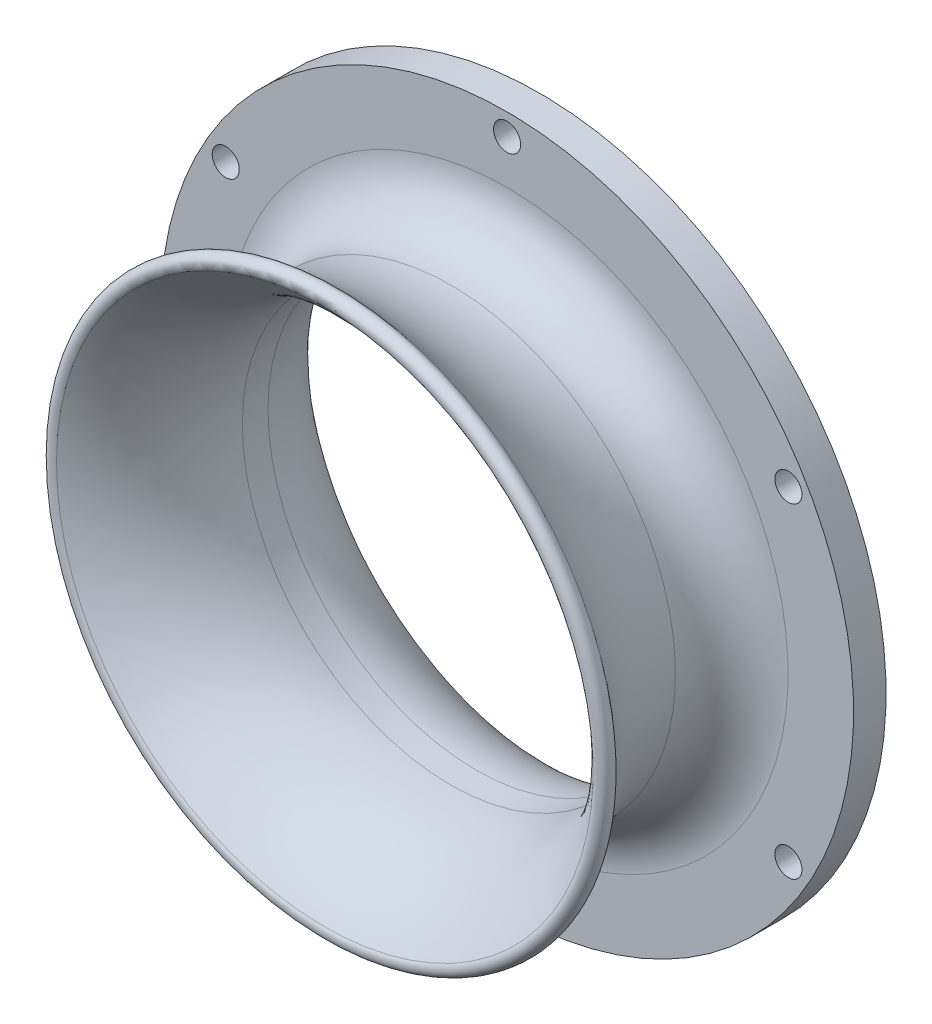
ISO-10303-21;
HEADER;
FILE_DESCRIPTION(('STEP AP214'),'2;1');
FILE_NAME('part.step','',(''),(''),'','','');
FILE_SCHEMA(('AUTOMOTIVE_DESIGN { 1 0 10303 214 1 1 1 1 }'));
ENDSEC;
DATA;
#1=APPLICATION_CONTEXT('core data for automotive mechanical design processes');
#2=APPLICATION_PROTOCOL_DEFINITION('international standard','automotive_design',2000,#1);
#3=PRODUCT_CONTEXT('',#1,'mechanical');
#4=PRODUCT('Part','Part','',(#3));
#5=PRODUCT_RELATED_PRODUCT_CATEGORY('part','',(#4));
#6=PRODUCT_DEFINITION_FORMATION('','',#4);
#7=PRODUCT_DEFINITION_CONTEXT('part definition',#1,'design');
#8=PRODUCT_DEFINITION('design','',#6,#7);
#9=PRODUCT_DEFINITION_SHAPE('','',#8);
#10=(LENGTH_UNIT() NAMED_UNIT(*) SI_UNIT(.MILLI.,.METRE.));
#11=(NAMED_UNIT(*) PLANE_ANGLE_UNIT() SI_UNIT($,.RADIAN.));
#12=(NAMED_UNIT(*) SI_UNIT($,.STERADIAN.) SOLID_ANGLE_UNIT());
#13=UNCERTAINTY_MEASURE_WITH_UNIT(LENGTH_MEASURE(1.E-05),#10,'distance_accuracy_value','');
#14=(GEOMETRIC_REPRESENTATION_CONTEXT(3) GLOBAL_UNCERTAINTY_ASSIGNED_CONTEXT((#13)) GLOBAL_UNIT_ASSIGNED_CONTEXT((#10,
#11,#12)) REPRESENTATION_CONTEXT('',''));
#15=CARTESIAN_POINT('',(0.,0.,0.));
#16=DIRECTION('',(0.,0.,1.));
#17=DIRECTION('',(1.,0.,0.));
#18=AXIS2_PLACEMENT_3D('',#15,#16,#17);
#19=CARTESIAN_POINT('',(0.,0.,-2.37036240834314));
#20=DIRECTION('',(0.,0.,-1.));
#21=DIRECTION('',(-1.,0.,0.));
#22=AXIS2_PLACEMENT_3D('',#19,#20,#21);
#23=TOROIDAL_SURFACE('',#22,28.1,8.85);
#24=CARTESIAN_POINT('',(0.,0.,-11.2));
#25=DIRECTION('',(0.,0.,-1.));
#26=DIRECTION('',(-1.,0.,0.));
#27=AXIS2_PLACEMENT_3D('',#24,#25,#26);
#28=CIRCLE('',#27,27.5);
#29=CARTESIAN_POINT('',(-27.5,0.,-11.2));
#30=VERTEX_POINT('',#29);
#31=EDGE_CURVE('E10',#30,#30,#28,.T.);
#32=ORIENTED_EDGE('',*,*,#31,.T.);
#33=EDGE_LOOP('',(#32));
#34=FACE_BOUND('',#33,.T.);
#35=CARTESIAN_POINT('',(0.,0.,-2.37036240834314));
#36=DIRECTION('',(0.,0.,-1.));
#37=DIRECTION('',(-1.,0.,0.));
#38=AXIS2_PLACEMENT_3D('',#35,#36,#37);
#39=CIRCLE('',#38,19.25);
#40=CARTESIAN_POINT('',(-19.25,0.,-2.37036240834314));
#41=VERTEX_POINT('',#40);
#42=EDGE_CURVE('E64',#41,#41,#39,.T.);
#43=ORIENTED_EDGE('',*,*,#42,.F.);
#44=EDGE_LOOP('',(#43));
#45=FACE_BOUND('',#44,.T.);
#46=ADVANCED_FACE('F30',(#34,#45),#23,.T.);
#47=CARTESIAN_POINT('',(0.,0.,0.));
#48=DIRECTION('',(0.,0.,-1.));
#49=DIRECTION('',(-1.,0.,0.));
#50=AXIS2_PLACEMENT_3D('',#47,#48,#49);
#51=CYLINDRICAL_SURFACE('',#50,27.5);
#52=CARTESIAN_POINT('',(0.,0.,-8.2));
#53=DIRECTION('',(0.,0.,-1.));
#54=DIRECTION('',(-1.,0.,0.));
#55=AXIS2_PLACEMENT_3D('',#52,#53,#54);
#56=CIRCLE('',#55,27.5);
#57=CARTESIAN_POINT('',(-27.5,0.,-8.2));
#58=VERTEX_POINT('',#57);
#59=EDGE_CURVE('E36',#58,#58,#56,.T.);
#60=ORIENTED_EDGE('',*,*,#59,.T.);
#61=EDGE_LOOP('',(#60));
#62=FACE_BOUND('',#61,.T.);
#63=ORIENTED_EDGE('',*,*,#31,.F.);
#64=EDGE_LOOP('',(#63));
#65=FACE_BOUND('',#64,.T.);
#66=ADVANCED_FACE('F134',(#62,#65),#51,.T.);
#67=CARTESIAN_POINT('',(0.,27.5,-8.2));
#68=DIRECTION('',(0.,0.,-1.));
#69=DIRECTION('',(-1.,0.,0.));
#70=AXIS2_PLACEMENT_3D('',#67,#68,#69);
#71=PLANE('',#70);
#72=CARTESIAN_POINT('',(-25.980762113533,15.0000000000003,-8.2));
#73=DIRECTION('',(0.,0.,-1.));
#74=DIRECTION('',(-1.,0.,0.));
#75=AXIS2_PLACEMENT_3D('',#72,#73,#74);
#76=CIRCLE('',#75,1.25);
#77=CARTESIAN_POINT('',(-27.230762113533,15.0000000000003,-8.2));
#78=VERTEX_POINT('',#77);
#79=EDGE_CURVE('E97',#78,#78,#76,.T.);
#80=ORIENTED_EDGE('',*,*,#79,.F.);
#81=EDGE_LOOP('',(#80));
#82=FACE_BOUND('',#81,.T.);
#83=CARTESIAN_POINT('',(-25.9807621135333,-14.9999999999998,-8.2));
#84=DIRECTION('',(0.,0.,-1.));
#85=DIRECTION('',(-1.,0.,0.));
#86=AXIS2_PLACEMENT_3D('',#83,#84,#85);
#87=CIRCLE('',#86,1.25);
#88=CARTESIAN_POINT('',(-27.2307621135333,-14.9999999999998,-8.2));
#89=VERTEX_POINT('',#88);
#90=EDGE_CURVE('E91',#89,#89,#87,.T.);
#91=ORIENTED_EDGE('',*,*,#90,.F.);
#92=EDGE_LOOP('',(#91));
#93=FACE_BOUND('',#92,.T.);
#94=CARTESIAN_POINT('',(0.,-30.,-8.2));
#95=DIRECTION('',(0.,0.,-1.));
#96=DIRECTION('',(-1.,0.,0.));
#97=AXIS2_PLACEMENT_3D('',#94,#95,#96);
#98=CIRCLE('',#97,1.25);
#99=CARTESIAN_POINT('',(-1.25,-30.,-8.2));
#100=VERTEX_POINT('',#99);
#101=EDGE_CURVE('E85',#100,#100,#98,.T.);
#102=ORIENTED_EDGE('',*,*,#101,.F.);
#103=EDGE_LOOP('',(#102));
#104=FACE_BOUND('',#103,.T.);
#105=CARTESIAN_POINT('',(25.9807621135331,-15.0000000000001,-8.2));
#106=DIRECTION('',(0.,0.,-1.));
#107=DIRECTION('',(-1.,0.,0.));
#108=AXIS2_PLACEMENT_3D('',#105,#106,#107);
#109=CIRCLE('',#108,1.25);
#110=CARTESIAN_POINT('',(24.7307621135331,-15.0000000000001,-8.2));
#111=VERTEX_POINT('',#110);
#112=EDGE_CURVE('E79',#111,#111,#109,.T.);
#113=ORIENTED_EDGE('',*,*,#112,.F.);
#114=EDGE_LOOP('',(#113));
#115=FACE_BOUND('',#114,.T.);
#116=CARTESIAN_POINT('',(25.9807621135332,14.9999999999999,-8.2));
#117=DIRECTION('',(0.,0.,-1.));
#118=DIRECTION('',(-1.,0.,0.));
#119=AXIS2_PLACEMENT_3D('',#116,#117,#118);
#120=CIRCLE('',#119,1.25);
#121=CARTESIAN_POINT('',(24.7307621135332,14.9999999999999,-8.2));
#122=VERTEX_POINT('',#121);
#123=EDGE_CURVE('E73',#122,#122,#120,.T.);
#124=ORIENTED_EDGE('',*,*,#123,.F.);
#125=EDGE_LOOP('',(#124));
#126=FACE_BOUND('',#125,.T.);
#127=CARTESIAN_POINT('',(0.,30.,-8.2));
#128=DIRECTION('',(0.,0.,-1.));
#129=DIRECTION('',(-1.,0.,0.));
#130=AXIS2_PLACEMENT_3D('',#127,#128,#129);
#131=CIRCLE('',#130,1.25);
#132=CARTESIAN_POINT('',(-1.25,30.,-8.2));
#133=VERTEX_POINT('',#132);
#134=EDGE_CURVE('E67',#133,#133,#131,.T.);
#135=ORIENTED_EDGE('',*,*,#134,.F.);
#136=EDGE_LOOP('',(#135));
#137=FACE_BOUND('',#136,.T.);
#138=CARTESIAN_POINT('',(0.,0.,-8.2));
#139=DIRECTION('',(0.,0.,-1.));
#140=DIRECTION('',(-1.,0.,0.));
#141=AXIS2_PLACEMENT_3D('',#138,#139,#140);
#142=CIRCLE('',#141,32.);
#143=CARTESIAN_POINT('',(-32.,0.,-8.2));
#144=VERTEX_POINT('',#143);
#145=EDGE_CURVE('E40',#144,#144,#142,.T.);
#146=ORIENTED_EDGE('',*,*,#145,.T.);
#147=EDGE_LOOP('',(#146));
#148=FACE_BOUND('',#147,.T.);
#149=ORIENTED_EDGE('',*,*,#59,.F.);
#150=EDGE_LOOP('',(#149));
#151=FACE_BOUND('',#150,.T.);
#152=ADVANCED_FACE('F128',(#82,#93,#104,#115,#126,#137,#148,#151),#71,.T.);
#153=CARTESIAN_POINT('',(0.,0.,0.));
#154=DIRECTION('',(0.,0.,-1.));
#155=DIRECTION('',(-1.,0.,0.));
#156=AXIS2_PLACEMENT_3D('',#153,#154,#155);
#157=CYLINDRICAL_SURFACE('',#156,32.);
#158=CARTESIAN_POINT('',(0.,0.,-5.2));
#159=DIRECTION('',(0.,0.,-1.));
#160=DIRECTION('',(-1.,0.,0.));
#161=AXIS2_PLACEMENT_3D('',#158,#159,#160);
#162=CIRCLE('',#161,32.);
#163=CARTESIAN_POINT('',(-32.,0.,-5.2));
#164=VERTEX_POINT('',#163);
#165=EDGE_CURVE('E44',#164,#164,#162,.T.);
#166=ORIENTED_EDGE('',*,*,#165,.T.);
#167=EDGE_LOOP('',(#166));
#168=FACE_BOUND('',#167,.T.);
#169=ORIENTED_EDGE('',*,*,#145,.F.);
#170=EDGE_LOOP('',(#169));
#171=FACE_BOUND('',#170,.T.);
#172=ADVANCED_FACE('F110',(#168,#171),#157,.T.);
#173=CARTESIAN_POINT('',(0.,32.,-5.2));
#174=DIRECTION('',(0.,0.,1.));
#175=DIRECTION('',(1.,0.,0.));
#176=AXIS2_PLACEMENT_3D('',#173,#174,#175);
#177=PLANE('',#176);
#178=CARTESIAN_POINT('',(-25.980762113533,15.0000000000003,-5.2));
#179=DIRECTION('',(0.,0.,1.));
#180=DIRECTION('',(1.,0.,0.));
#181=AXIS2_PLACEMENT_3D('',#178,#179,#180);
#182=CIRCLE('',#181,1.25);
#183=CARTESIAN_POINT('',(-24.730762113533,15.0000000000003,-5.2));
#184=VERTEX_POINT('',#183);
#185=EDGE_CURVE('E100',#184,#184,#182,.T.);
#186=ORIENTED_EDGE('',*,*,#185,.F.);
#187=EDGE_LOOP('',(#186));
#188=FACE_BOUND('',#187,.T.);
#189=CARTESIAN_POINT('',(-25.9807621135333,-14.9999999999998,-5.2));
#190=DIRECTION('',(0.,0.,1.));
#191=DIRECTION('',(1.,0.,0.));
#192=AXIS2_PLACEMENT_3D('',#189,#190,#191);
#193=CIRCLE('',#192,1.25);
#194=CARTESIAN_POINT('',(-24.7307621135333,-14.9999999999998,-5.2));
#195=VERTEX_POINT('',#194);
#196=EDGE_CURVE('E94',#195,#195,#193,.T.);
#197=ORIENTED_EDGE('',*,*,#196,.F.);
#198=EDGE_LOOP('',(#197));
#199=FACE_BOUND('',#198,.T.);
#200=CARTESIAN_POINT('',(0.,-30.,-5.2));
#201=DIRECTION('',(0.,0.,1.));
#202=DIRECTION('',(1.,0.,0.));
#203=AXIS2_PLACEMENT_3D('',#200,#201,#202);
#204=CIRCLE('',#203,1.25);
#205=CARTESIAN_POINT('',(1.25,-30.,-5.2));
#206=VERTEX_POINT('',#205);
#207=EDGE_CURVE('E88',#206,#206,#204,.T.);
#208=ORIENTED_EDGE('',*,*,#207,.F.);
#209=EDGE_LOOP('',(#208));
#210=FACE_BOUND('',#209,.T.);
#211=CARTESIAN_POINT('',(25.9807621135331,-15.0000000000001,-5.2));
#212=DIRECTION('',(0.,0.,1.));
#213=DIRECTION('',(1.,0.,0.));
#214=AXIS2_PLACEMENT_3D('',#211,#212,#213);
#215=CIRCLE('',#214,1.25);
#216=CARTESIAN_POINT('',(27.2307621135331,-15.0000000000001,-5.2));
#217=VERTEX_POINT('',#216);
#218=EDGE_CURVE('E82',#217,#217,#215,.T.);
#219=ORIENTED_EDGE('',*,*,#218,.F.);
#220=EDGE_LOOP('',(#219));
#221=FACE_BOUND('',#220,.T.);
#222=CARTESIAN_POINT('',(25.9807621135332,14.9999999999999,-5.2));
#223=DIRECTION('',(0.,0.,1.));
#224=DIRECTION('',(1.,0.,0.));
#225=AXIS2_PLACEMENT_3D('',#222,#223,#224);
#226=CIRCLE('',#225,1.25);
#227=CARTESIAN_POINT('',(27.2307621135332,14.9999999999999,-5.2));
#228=VERTEX_POINT('',#227);
#229=EDGE_CURVE('E76',#228,#228,#226,.T.);
#230=ORIENTED_EDGE('',*,*,#229,.F.);
#231=EDGE_LOOP('',(#230));
#232=FACE_BOUND('',#231,.T.);
#233=CARTESIAN_POINT('',(0.,30.,-5.2));
#234=DIRECTION('',(0.,0.,1.));
#235=DIRECTION('',(1.,0.,0.));
#236=AXIS2_PLACEMENT_3D('',#233,#234,#235);
#237=CIRCLE('',#236,1.25);
#238=CARTESIAN_POINT('',(1.25,30.,-5.2));
#239=VERTEX_POINT('',#238);
#240=EDGE_CURVE('E70',#239,#239,#237,.T.);
#241=ORIENTED_EDGE('',*,*,#240,.F.);
#242=EDGE_LOOP('',(#241));
#243=FACE_BOUND('',#242,.T.);
#244=CARTESIAN_POINT('',(0.,0.,-5.2));
#245=DIRECTION('',(0.,0.,-1.));
#246=DIRECTION('',(-1.,0.,0.));
#247=AXIS2_PLACEMENT_3D('',#244,#245,#246);
#248=CIRCLE('',#247,25.95);
#249=CARTESIAN_POINT('',(-25.95,0.,-5.2));
#250=VERTEX_POINT('',#249);
#251=EDGE_CURVE('E49',#250,#250,#248,.T.);
#252=ORIENTED_EDGE('',*,*,#251,.T.);
#253=EDGE_LOOP('',(#252));
#254=FACE_BOUND('',#253,.T.);
#255=ORIENTED_EDGE('',*,*,#165,.F.);
#256=EDGE_LOOP('',(#255));
#257=FACE_BOUND('',#256,.T.);
#258=ADVANCED_FACE('F106',(#188,#199,#210,#221,#232,#243,#254,#257),#177,.T.);
#259=CARTESIAN_POINT('',(0.,0.,0.));
#260=DIRECTION('',(0.,0.,-1.));
#261=DIRECTION('',(-1.,0.,0.));
#262=AXIS2_PLACEMENT_3D('',#259,#260,#261);
#263=TOROIDAL_SURFACE('',#262,25.95,5.2);
#264=CARTESIAN_POINT('',(0.,0.,0.));
#265=DIRECTION('',(0.,0.,-1.));
#266=DIRECTION('',(-1.,0.,0.));
#267=AXIS2_PLACEMENT_3D('',#264,#265,#266);
#268=CIRCLE('',#267,20.75);
#269=CARTESIAN_POINT('',(-20.75,0.,0.));
#270=VERTEX_POINT('',#269);
#271=EDGE_CURVE('E52',#270,#270,#268,.T.);
#272=ORIENTED_EDGE('',*,*,#271,.T.);
#273=EDGE_LOOP('',(#272));
#274=FACE_BOUND('',#273,.T.);
#275=ORIENTED_EDGE('',*,*,#251,.F.);
#276=EDGE_LOOP('',(#275));
#277=FACE_BOUND('',#276,.T.);
#278=ADVANCED_FACE('F109',(#274,#277),#263,.F.);
#279=CARTESIAN_POINT('',(0.,0.,0.));
#280=DIRECTION('',(0.,0.,-1.));
#281=DIRECTION('',(-1.,0.,0.));
#282=AXIS2_PLACEMENT_3D('',#279,#280,#281);
#283=TOROIDAL_SURFACE('',#282,34.25,13.5);
#284=CARTESIAN_POINT('',(0.,0.,10.4684210526316));
#285=DIRECTION('',(0.,0.,-1.));
#286=DIRECTION('',(-1.,0.,0.));
#287=AXIS2_PLACEMENT_3D('',#284,#285,#286);
#288=CIRCLE('',#287,25.7257897336574);
#289=CARTESIAN_POINT('',(-25.7257897336574,0.,10.4684210526316));
#290=VERTEX_POINT('',#289);
#291=EDGE_CURVE('E55',#290,#290,#288,.T.);
#292=ORIENTED_EDGE('',*,*,#291,.T.);
#293=EDGE_LOOP('',(#292));
#294=FACE_BOUND('',#293,.T.);
#295=ORIENTED_EDGE('',*,*,#271,.F.);
#296=EDGE_LOOP('',(#295));
#297=FACE_BOUND('',#296,.T.);
#298=ADVANCED_FACE('F164',(#294,#297),#283,.F.);
#299=CARTESIAN_POINT('',(0.,0.,11.05));
#300=DIRECTION('',(0.,0.,-1.));
#301=DIRECTION('',(-1.,0.,0.));
#302=AXIS2_PLACEMENT_3D('',#299,#300,#301);
#303=TOROIDAL_SURFACE('',#302,25.2522224966384,0.75);
#304=CARTESIAN_POINT('',(0.,0.,11.6315789473684));
#305=DIRECTION('',(0.,0.,-1.));
#306=DIRECTION('',(-1.,0.,0.));
#307=AXIS2_PLACEMENT_3D('',#304,#305,#306);
#308=CIRCLE('',#307,24.7786552596194);
#309=CARTESIAN_POINT('',(-24.7786552596194,0.,11.6315789473684));
#310=VERTEX_POINT('',#309);
#311=EDGE_CURVE('E58',#310,#310,#308,.T.);
#312=ORIENTED_EDGE('',*,*,#311,.T.);
#313=EDGE_LOOP('',(#312));
#314=FACE_BOUND('',#313,.T.);
#315=ORIENTED_EDGE('',*,*,#291,.F.);
#316=EDGE_LOOP('',(#315));
#317=FACE_BOUND('',#316,.T.);
#318=ADVANCED_FACE('F158',(#314,#317),#303,.T.);
#319=CARTESIAN_POINT('',(0.,0.,0.));
#320=DIRECTION('',(0.,0.,-1.));
#321=DIRECTION('',(-1.,0.,0.));
#322=AXIS2_PLACEMENT_3D('',#319,#320,#321);
#323=TOROIDAL_SURFACE('',#322,34.25,15.);
#324=CARTESIAN_POINT('',(0.,0.,0.));
#325=DIRECTION('',(0.,0.,-1.));
#326=DIRECTION('',(-1.,0.,0.));
#327=AXIS2_PLACEMENT_3D('',#324,#325,#326);
#328=CIRCLE('',#327,19.25);
#329=CARTESIAN_POINT('',(-19.25,0.,0.));
#330=VERTEX_POINT('',#329);
#331=EDGE_CURVE('E61',#330,#330,#328,.T.);
#332=ORIENTED_EDGE('',*,*,#331,.T.);
#333=EDGE_LOOP('',(#332));
#334=FACE_BOUND('',#333,.T.);
#335=ORIENTED_EDGE('',*,*,#311,.F.);
#336=EDGE_LOOP('',(#335));
#337=FACE_BOUND('',#336,.T.);
#338=ADVANCED_FACE('F152',(#334,#337),#323,.T.);
#339=CARTESIAN_POINT('',(0.,0.,0.));
#340=DIRECTION('',(0.,0.,-1.));
#341=DIRECTION('',(-1.,0.,0.));
#342=AXIS2_PLACEMENT_3D('',#339,#340,#341);
#343=CYLINDRICAL_SURFACE('',#342,19.25);
#344=ORIENTED_EDGE('',*,*,#42,.T.);
#345=EDGE_LOOP('',(#344));
#346=FACE_BOUND('',#345,.T.);
#347=ORIENTED_EDGE('',*,*,#331,.F.);
#348=EDGE_LOOP('',(#347));
#349=FACE_BOUND('',#348,.T.);
#350=ADVANCED_FACE('F148',(#346,#349),#343,.F.);
#351=CARTESIAN_POINT('',(0.,30.,-5.2));
#352=DIRECTION('',(0.,0.,1.));
#353=DIRECTION('',(1.,0.,0.));
#354=AXIS2_PLACEMENT_3D('',#351,#352,#353);
#355=CYLINDRICAL_SURFACE('',#354,1.25);
#356=ORIENTED_EDGE('',*,*,#134,.T.);
#357=EDGE_LOOP('',(#356));
#358=FACE_BOUND('',#357,.T.);
#359=ORIENTED_EDGE('',*,*,#240,.T.);
#360=EDGE_LOOP('',(#359));
#361=FACE_BOUND('',#360,.T.);
#362=ADVANCED_FACE('F151',(#358,#361),#355,.F.);
#363=CARTESIAN_POINT('',(25.9807621135332,14.9999999999999,-5.2));
#364=DIRECTION('',(0.,0.,1.));
#365=DIRECTION('',(1.,0.,0.));
#366=AXIS2_PLACEMENT_3D('',#363,#364,#365);
#367=CYLINDRICAL_SURFACE('',#366,1.25);
#368=ORIENTED_EDGE('',*,*,#123,.T.);
#369=EDGE_LOOP('',(#368));
#370=FACE_BOUND('',#369,.T.);
#371=ORIENTED_EDGE('',*,*,#229,.T.);
#372=EDGE_LOOP('',(#371));
#373=FACE_BOUND('',#372,.T.);
#374=ADVANCED_FACE('F181',(#370,#373),#367,.F.);
#375=CARTESIAN_POINT('',(25.9807621135331,-15.0000000000001,-5.2));
#376=DIRECTION('',(0.,0.,1.));
#377=DIRECTION('',(1.,0.,0.));
#378=AXIS2_PLACEMENT_3D('',#375,#376,#377);
#379=CYLINDRICAL_SURFACE('',#378,1.25);
#380=ORIENTED_EDGE('',*,*,#112,.T.);
#381=EDGE_LOOP('',(#380));
#382=FACE_BOUND('',#381,.T.);
#383=ORIENTED_EDGE('',*,*,#218,.T.);
#384=EDGE_LOOP('',(#383));
#385=FACE_BOUND('',#384,.T.);
#386=ADVANCED_FACE('F185',(#382,#385),#379,.F.);
#387=CARTESIAN_POINT('',(0.,-30.,-5.2));
#388=DIRECTION('',(0.,0.,1.));
#389=DIRECTION('',(1.,0.,0.));
#390=AXIS2_PLACEMENT_3D('',#387,#388,#389);
#391=CYLINDRICAL_SURFACE('',#390,1.25);
#392=ORIENTED_EDGE('',*,*,#101,.T.);
#393=EDGE_LOOP('',(#392));
#394=FACE_BOUND('',#393,.T.);
#395=ORIENTED_EDGE('',*,*,#207,.T.);
#396=EDGE_LOOP('',(#395));
#397=FACE_BOUND('',#396,.T.);
#398=ADVANCED_FACE('F189',(#394,#397),#391,.F.);
#399=CARTESIAN_POINT('',(-25.9807621135333,-14.9999999999998,-5.2));
#400=DIRECTION('',(0.,0.,1.));
#401=DIRECTION('',(1.,0.,0.));
#402=AXIS2_PLACEMENT_3D('',#399,#400,#401);
#403=CYLINDRICAL_SURFACE('',#402,1.25);
#404=ORIENTED_EDGE('',*,*,#90,.T.);
#405=EDGE_LOOP('',(#404));
#406=FACE_BOUND('',#405,.T.);
#407=ORIENTED_EDGE('',*,*,#196,.T.);
#408=EDGE_LOOP('',(#407));
#409=FACE_BOUND('',#408,.T.);
#410=ADVANCED_FACE('F193',(#406,#409),#403,.F.);
#411=CARTESIAN_POINT('',(-25.980762113533,15.0000000000003,-5.2));
#412=DIRECTION('',(0.,0.,1.));
#413=DIRECTION('',(1.,0.,0.));
#414=AXIS2_PLACEMENT_3D('',#411,#412,#413);
#415=CYLINDRICAL_SURFACE('',#414,1.25);
#416=ORIENTED_EDGE('',*,*,#79,.T.);
#417=EDGE_LOOP('',(#416));
#418=FACE_BOUND('',#417,.T.);
#419=ORIENTED_EDGE('',*,*,#185,.T.);
#420=EDGE_LOOP('',(#419));
#421=FACE_BOUND('',#420,.T.);
#422=ADVANCED_FACE('F104',(#418,#421),#415,.F.);
#423=CLOSED_SHELL('',(#46,#66,#152,#172,#258,#278,#298,#318,#338,#350,#362,#374,#386,#398,#410,#422));
#424=MANIFOLD_SOLID_BREP('B2',#423);
#425=ADVANCED_BREP_SHAPE_REPRESENTATION('',(#18,#424),#14);
#426=SHAPE_DEFINITION_REPRESENTATION(#9,#425);
ENDSEC;
END-ISO-10303-21;
